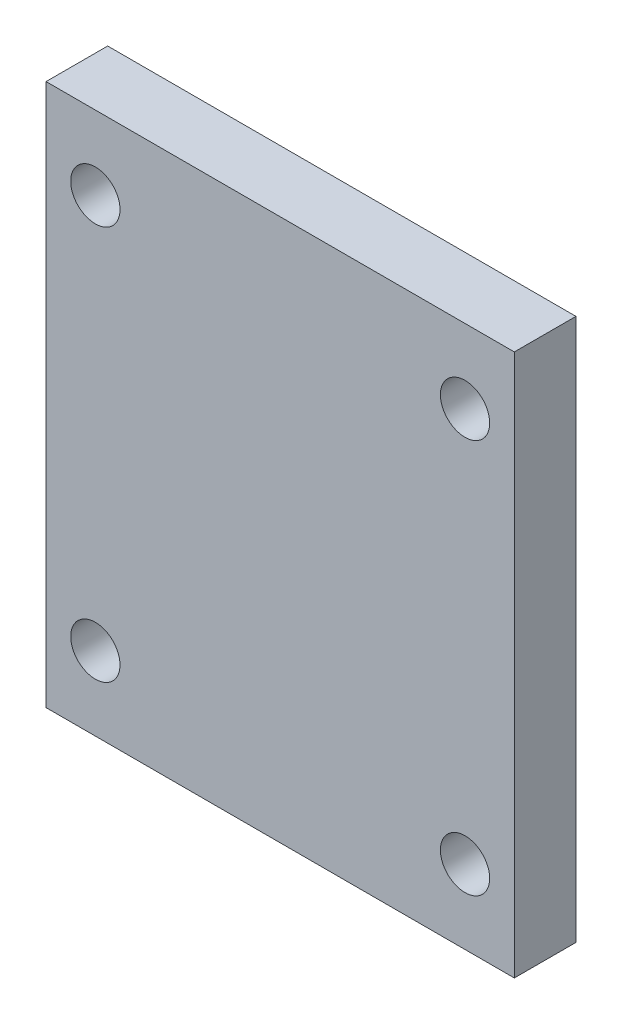
ISO-10303-21;
HEADER;
FILE_DESCRIPTION(('STEP AP214'),'2;1');
FILE_NAME('part.step','',(''),(''),'','','');
FILE_SCHEMA(('AUTOMOTIVE_DESIGN { 1 0 10303 214 1 1 1 1 }'));
ENDSEC;
DATA;
#1=APPLICATION_CONTEXT('core data for automotive mechanical design processes');
#2=APPLICATION_PROTOCOL_DEFINITION('international standard','automotive_design',2000,#1);
#3=PRODUCT_CONTEXT('',#1,'mechanical');
#4=PRODUCT('Part','Part','',(#3));
#5=PRODUCT_RELATED_PRODUCT_CATEGORY('part','',(#4));
#6=PRODUCT_DEFINITION_FORMATION('','',#4);
#7=PRODUCT_DEFINITION_CONTEXT('part definition',#1,'design');
#8=PRODUCT_DEFINITION('design','',#6,#7);
#9=PRODUCT_DEFINITION_SHAPE('','',#8);
#10=(LENGTH_UNIT() NAMED_UNIT(*) SI_UNIT(.MILLI.,.METRE.));
#11=(NAMED_UNIT(*) PLANE_ANGLE_UNIT() SI_UNIT($,.RADIAN.));
#12=(NAMED_UNIT(*) SI_UNIT($,.STERADIAN.) SOLID_ANGLE_UNIT());
#13=UNCERTAINTY_MEASURE_WITH_UNIT(LENGTH_MEASURE(1.E-05),#10,'distance_accuracy_value','');
#14=(GEOMETRIC_REPRESENTATION_CONTEXT(3) GLOBAL_UNCERTAINTY_ASSIGNED_CONTEXT((#13)) GLOBAL_UNIT_ASSIGNED_CONTEXT((#10,
#11,#12)) REPRESENTATION_CONTEXT('',''));
#15=CARTESIAN_POINT('',(0.,0.,0.));
#16=DIRECTION('',(0.,0.,1.));
#17=DIRECTION('',(1.,0.,0.));
#18=AXIS2_PLACEMENT_3D('',#15,#16,#17);
#19=CARTESIAN_POINT('',(0.,0.,5.));
#20=DIRECTION('',(0.,0.,-1.));
#21=DIRECTION('',(-1.,0.,0.));
#22=AXIS2_PLACEMENT_3D('',#19,#20,#21);
#23=PLANE('',#22);
#24=DIRECTION('',(0.,-1.,0.));
#25=VECTOR('',#24,1.);
#26=CARTESIAN_POINT('',(0.,0.,5.));
#27=LINE('',#26,#25);
#28=CARTESIAN_POINT('',(0.,44.,5.));
#29=VERTEX_POINT('',#28);
#30=CARTESIAN_POINT('',(0.,0.,5.));
#31=VERTEX_POINT('',#30);
#32=EDGE_CURVE('E92',#29,#31,#27,.T.);
#33=ORIENTED_EDGE('',*,*,#32,.T.);
#34=DIRECTION('',(1.,0.,0.));
#35=VECTOR('',#34,1.);
#36=CARTESIAN_POINT('',(0.,0.,5.));
#37=LINE('',#36,#35);
#38=CARTESIAN_POINT('',(38.,0.,5.));
#39=VERTEX_POINT('',#38);
#40=EDGE_CURVE('E87',#31,#39,#37,.T.);
#41=ORIENTED_EDGE('',*,*,#40,.T.);
#42=DIRECTION('',(0.,1.,0.));
#43=VECTOR('',#42,1.);
#44=CARTESIAN_POINT('',(38.,0.,5.));
#45=LINE('',#44,#43);
#46=CARTESIAN_POINT('',(38.,44.,5.));
#47=VERTEX_POINT('',#46);
#48=EDGE_CURVE('E90',#39,#47,#45,.T.);
#49=ORIENTED_EDGE('',*,*,#48,.T.);
#50=DIRECTION('',(-1.,0.,0.));
#51=VECTOR('',#50,1.);
#52=CARTESIAN_POINT('',(0.,44.,5.));
#53=LINE('',#52,#51);
#54=EDGE_CURVE('E57',#47,#29,#53,.T.);
#55=ORIENTED_EDGE('',*,*,#54,.T.);
#56=EDGE_LOOP('',(#33,#41,#49,#55));
#57=FACE_BOUND('',#56,.T.);
#58=CARTESIAN_POINT('',(4.,38.,5.));
#59=DIRECTION('',(0.,0.,1.));
#60=DIRECTION('',(1.,0.,0.));
#61=AXIS2_PLACEMENT_3D('',#58,#59,#60);
#62=CIRCLE('',#61,2.);
#63=CARTESIAN_POINT('',(6.,38.,5.));
#64=VERTEX_POINT('',#63);
#65=EDGE_CURVE('E112',#64,#64,#62,.T.);
#66=ORIENTED_EDGE('',*,*,#65,.F.);
#67=EDGE_LOOP('',(#66));
#68=FACE_BOUND('',#67,.T.);
#69=CARTESIAN_POINT('',(34.,38.,5.));
#70=DIRECTION('',(0.,0.,1.));
#71=DIRECTION('',(1.,0.,0.));
#72=AXIS2_PLACEMENT_3D('',#69,#70,#71);
#73=CIRCLE('',#72,2.);
#74=CARTESIAN_POINT('',(36.,38.,5.));
#75=VERTEX_POINT('',#74);
#76=EDGE_CURVE('E134',#75,#75,#73,.T.);
#77=ORIENTED_EDGE('',*,*,#76,.F.);
#78=EDGE_LOOP('',(#77));
#79=FACE_BOUND('',#78,.T.);
#80=CARTESIAN_POINT('',(34.,6.,5.));
#81=DIRECTION('',(0.,0.,1.));
#82=DIRECTION('',(1.,0.,0.));
#83=AXIS2_PLACEMENT_3D('',#80,#81,#82);
#84=CIRCLE('',#83,2.);
#85=CARTESIAN_POINT('',(36.,6.,5.));
#86=VERTEX_POINT('',#85);
#87=EDGE_CURVE('E142',#86,#86,#84,.T.);
#88=ORIENTED_EDGE('',*,*,#87,.F.);
#89=EDGE_LOOP('',(#88));
#90=FACE_BOUND('',#89,.T.);
#91=CARTESIAN_POINT('',(4.,6.,5.));
#92=DIRECTION('',(0.,0.,1.));
#93=DIRECTION('',(1.,0.,0.));
#94=AXIS2_PLACEMENT_3D('',#91,#92,#93);
#95=CIRCLE('',#94,2.);
#96=CARTESIAN_POINT('',(6.,6.,5.));
#97=VERTEX_POINT('',#96);
#98=EDGE_CURVE('E150',#97,#97,#95,.T.);
#99=ORIENTED_EDGE('',*,*,#98,.F.);
#100=EDGE_LOOP('',(#99));
#101=FACE_BOUND('',#100,.T.);
#102=ADVANCED_FACE('F39',(#57,#68,#79,#90,#101),#23,.F.);
#103=CARTESIAN_POINT('',(0.,0.,0.));
#104=DIRECTION('',(0.,0.,-1.));
#105=DIRECTION('',(-1.,0.,0.));
#106=AXIS2_PLACEMENT_3D('',#103,#104,#105);
#107=PLANE('',#106);
#108=CARTESIAN_POINT('',(34.,6.,0.));
#109=DIRECTION('',(0.,0.,1.));
#110=DIRECTION('',(1.,0.,0.));
#111=AXIS2_PLACEMENT_3D('',#108,#109,#110);
#112=CIRCLE('',#111,2.);
#113=CARTESIAN_POINT('',(36.,6.,0.));
#114=VERTEX_POINT('',#113);
#115=EDGE_CURVE('E146',#114,#114,#112,.T.);
#116=ORIENTED_EDGE('',*,*,#115,.T.);
#117=EDGE_LOOP('',(#116));
#118=FACE_BOUND('',#117,.T.);
#119=CARTESIAN_POINT('',(4.,38.,0.));
#120=DIRECTION('',(0.,0.,1.));
#121=DIRECTION('',(1.,0.,0.));
#122=AXIS2_PLACEMENT_3D('',#119,#120,#121);
#123=CIRCLE('',#122,2.);
#124=CARTESIAN_POINT('',(6.,38.,0.));
#125=VERTEX_POINT('',#124);
#126=EDGE_CURVE('E130',#125,#125,#123,.T.);
#127=ORIENTED_EDGE('',*,*,#126,.T.);
#128=EDGE_LOOP('',(#127));
#129=FACE_BOUND('',#128,.T.);
#130=DIRECTION('',(0.,-1.,0.));
#131=VECTOR('',#130,1.);
#132=CARTESIAN_POINT('',(0.,0.,0.));
#133=LINE('',#132,#131);
#134=CARTESIAN_POINT('',(0.,44.,0.));
#135=VERTEX_POINT('',#134);
#136=CARTESIAN_POINT('',(0.,0.,0.));
#137=VERTEX_POINT('',#136);
#138=EDGE_CURVE('E108',#135,#137,#133,.T.);
#139=ORIENTED_EDGE('',*,*,#138,.F.);
#140=DIRECTION('',(-1.,0.,0.));
#141=VECTOR('',#140,1.);
#142=CARTESIAN_POINT('',(0.,44.,0.));
#143=LINE('',#142,#141);
#144=CARTESIAN_POINT('',(38.,44.,0.));
#145=VERTEX_POINT('',#144);
#146=EDGE_CURVE('E80',#145,#135,#143,.T.);
#147=ORIENTED_EDGE('',*,*,#146,.F.);
#148=DIRECTION('',(0.,1.,0.));
#149=VECTOR('',#148,1.);
#150=CARTESIAN_POINT('',(38.,0.,0.));
#151=LINE('',#150,#149);
#152=CARTESIAN_POINT('',(38.,0.,0.));
#153=VERTEX_POINT('',#152);
#154=EDGE_CURVE('E74',#153,#145,#151,.T.);
#155=ORIENTED_EDGE('',*,*,#154,.F.);
#156=DIRECTION('',(1.,0.,0.));
#157=VECTOR('',#156,1.);
#158=CARTESIAN_POINT('',(0.,0.,0.));
#159=LINE('',#158,#157);
#160=EDGE_CURVE('E97',#137,#153,#159,.T.);
#161=ORIENTED_EDGE('',*,*,#160,.F.);
#162=EDGE_LOOP('',(#139,#147,#155,#161));
#163=FACE_BOUND('',#162,.T.);
#164=CARTESIAN_POINT('',(34.,38.,0.));
#165=DIRECTION('',(0.,0.,1.));
#166=DIRECTION('',(1.,0.,0.));
#167=AXIS2_PLACEMENT_3D('',#164,#165,#166);
#168=CIRCLE('',#167,2.);
#169=CARTESIAN_POINT('',(36.,38.,0.));
#170=VERTEX_POINT('',#169);
#171=EDGE_CURVE('E138',#170,#170,#168,.T.);
#172=ORIENTED_EDGE('',*,*,#171,.T.);
#173=EDGE_LOOP('',(#172));
#174=FACE_BOUND('',#173,.T.);
#175=CARTESIAN_POINT('',(4.,6.,0.));
#176=DIRECTION('',(0.,0.,1.));
#177=DIRECTION('',(1.,0.,0.));
#178=AXIS2_PLACEMENT_3D('',#175,#176,#177);
#179=CIRCLE('',#178,2.);
#180=CARTESIAN_POINT('',(6.,6.,0.));
#181=VERTEX_POINT('',#180);
#182=EDGE_CURVE('E154',#181,#181,#179,.T.);
#183=ORIENTED_EDGE('',*,*,#182,.T.);
#184=EDGE_LOOP('',(#183));
#185=FACE_BOUND('',#184,.T.);
#186=ADVANCED_FACE('F125',(#118,#129,#163,#174,#185),#107,.T.);
#187=CARTESIAN_POINT('',(0.,0.,5.));
#188=DIRECTION('',(1.,0.,0.));
#189=DIRECTION('',(0.,0.,-1.));
#190=AXIS2_PLACEMENT_3D('',#187,#188,#189);
#191=PLANE('',#190);
#192=ORIENTED_EDGE('',*,*,#138,.T.);
#193=DIRECTION('',(0.,0.,-1.));
#194=VECTOR('',#193,1.);
#195=CARTESIAN_POINT('',(0.,0.,5.));
#196=LINE('',#195,#194);
#197=EDGE_CURVE('E11',#31,#137,#196,.T.);
#198=ORIENTED_EDGE('',*,*,#197,.F.);
#199=ORIENTED_EDGE('',*,*,#32,.F.);
#200=DIRECTION('',(0.,0.,-1.));
#201=VECTOR('',#200,1.);
#202=CARTESIAN_POINT('',(0.,44.,5.));
#203=LINE('',#202,#201);
#204=EDGE_CURVE('E104',#29,#135,#203,.T.);
#205=ORIENTED_EDGE('',*,*,#204,.T.);
#206=EDGE_LOOP('',(#192,#198,#199,#205));
#207=FACE_BOUND('',#206,.T.);
#208=ADVANCED_FACE('F41',(#207),#191,.F.);
#209=CARTESIAN_POINT('',(0.,0.,5.));
#210=DIRECTION('',(0.,1.,0.));
#211=DIRECTION('',(0.,0.,1.));
#212=AXIS2_PLACEMENT_3D('',#209,#210,#211);
#213=PLANE('',#212);
#214=ORIENTED_EDGE('',*,*,#160,.T.);
#215=DIRECTION('',(0.,0.,-1.));
#216=VECTOR('',#215,1.);
#217=CARTESIAN_POINT('',(38.,0.,5.));
#218=LINE('',#217,#216);
#219=EDGE_CURVE('E49',#39,#153,#218,.T.);
#220=ORIENTED_EDGE('',*,*,#219,.F.);
#221=ORIENTED_EDGE('',*,*,#40,.F.);
#222=ORIENTED_EDGE('',*,*,#197,.T.);
#223=EDGE_LOOP('',(#214,#220,#221,#222));
#224=FACE_BOUND('',#223,.T.);
#225=ADVANCED_FACE('F96',(#224),#213,.F.);
#226=CARTESIAN_POINT('',(38.,0.,5.));
#227=DIRECTION('',(-1.,0.,0.));
#228=DIRECTION('',(0.,0.,1.));
#229=AXIS2_PLACEMENT_3D('',#226,#227,#228);
#230=PLANE('',#229);
#231=ORIENTED_EDGE('',*,*,#154,.T.);
#232=DIRECTION('',(0.,0.,-1.));
#233=VECTOR('',#232,1.);
#234=CARTESIAN_POINT('',(38.,44.,5.));
#235=LINE('',#234,#233);
#236=EDGE_CURVE('E99',#47,#145,#235,.T.);
#237=ORIENTED_EDGE('',*,*,#236,.F.);
#238=ORIENTED_EDGE('',*,*,#48,.F.);
#239=ORIENTED_EDGE('',*,*,#219,.T.);
#240=EDGE_LOOP('',(#231,#237,#238,#239));
#241=FACE_BOUND('',#240,.T.);
#242=ADVANCED_FACE('F100',(#241),#230,.F.);
#243=CARTESIAN_POINT('',(0.,44.,5.));
#244=DIRECTION('',(0.,-1.,0.));
#245=DIRECTION('',(0.,0.,-1.));
#246=AXIS2_PLACEMENT_3D('',#243,#244,#245);
#247=PLANE('',#246);
#248=ORIENTED_EDGE('',*,*,#146,.T.);
#249=ORIENTED_EDGE('',*,*,#204,.F.);
#250=ORIENTED_EDGE('',*,*,#54,.F.);
#251=ORIENTED_EDGE('',*,*,#236,.T.);
#252=EDGE_LOOP('',(#248,#249,#250,#251));
#253=FACE_BOUND('',#252,.T.);
#254=ADVANCED_FACE('F122',(#253),#247,.F.);
#255=CARTESIAN_POINT('',(4.,38.,5.));
#256=DIRECTION('',(0.,0.,-1.));
#257=DIRECTION('',(-1.,0.,0.));
#258=AXIS2_PLACEMENT_3D('',#255,#256,#257);
#259=CYLINDRICAL_SURFACE('',#258,2.);
#260=ORIENTED_EDGE('',*,*,#65,.T.);
#261=EDGE_LOOP('',(#260));
#262=FACE_BOUND('',#261,.T.);
#263=ORIENTED_EDGE('',*,*,#126,.F.);
#264=EDGE_LOOP('',(#263));
#265=FACE_BOUND('',#264,.T.);
#266=ADVANCED_FACE('F173',(#262,#265),#259,.F.);
#267=CARTESIAN_POINT('',(34.,38.,5.));
#268=DIRECTION('',(0.,0.,-1.));
#269=DIRECTION('',(-1.,0.,0.));
#270=AXIS2_PLACEMENT_3D('',#267,#268,#269);
#271=CYLINDRICAL_SURFACE('',#270,2.);
#272=ORIENTED_EDGE('',*,*,#76,.T.);
#273=EDGE_LOOP('',(#272));
#274=FACE_BOUND('',#273,.T.);
#275=ORIENTED_EDGE('',*,*,#171,.F.);
#276=EDGE_LOOP('',(#275));
#277=FACE_BOUND('',#276,.T.);
#278=ADVANCED_FACE('F219',(#274,#277),#271,.F.);
#279=CARTESIAN_POINT('',(34.,6.,5.));
#280=DIRECTION('',(0.,0.,-1.));
#281=DIRECTION('',(-1.,0.,0.));
#282=AXIS2_PLACEMENT_3D('',#279,#280,#281);
#283=CYLINDRICAL_SURFACE('',#282,2.);
#284=ORIENTED_EDGE('',*,*,#87,.T.);
#285=EDGE_LOOP('',(#284));
#286=FACE_BOUND('',#285,.T.);
#287=ORIENTED_EDGE('',*,*,#115,.F.);
#288=EDGE_LOOP('',(#287));
#289=FACE_BOUND('',#288,.T.);
#290=ADVANCED_FACE('F227',(#286,#289),#283,.F.);
#291=CARTESIAN_POINT('',(4.,6.,5.));
#292=DIRECTION('',(0.,0.,-1.));
#293=DIRECTION('',(-1.,0.,0.));
#294=AXIS2_PLACEMENT_3D('',#291,#292,#293);
#295=CYLINDRICAL_SURFACE('',#294,2.);
#296=ORIENTED_EDGE('',*,*,#98,.T.);
#297=EDGE_LOOP('',(#296));
#298=FACE_BOUND('',#297,.T.);
#299=ORIENTED_EDGE('',*,*,#182,.F.);
#300=EDGE_LOOP('',(#299));
#301=FACE_BOUND('',#300,.T.);
#302=ADVANCED_FACE('F162',(#298,#301),#295,.F.);
#303=CLOSED_SHELL('',(#102,#186,#208,#225,#242,#254,#266,#278,#290,#302));
#304=MANIFOLD_SOLID_BREP('B2',#303);
#305=ADVANCED_BREP_SHAPE_REPRESENTATION('',(#18,#304),#14);
#306=SHAPE_DEFINITION_REPRESENTATION(#9,#305);
ENDSEC;
END-ISO-10303-21;
